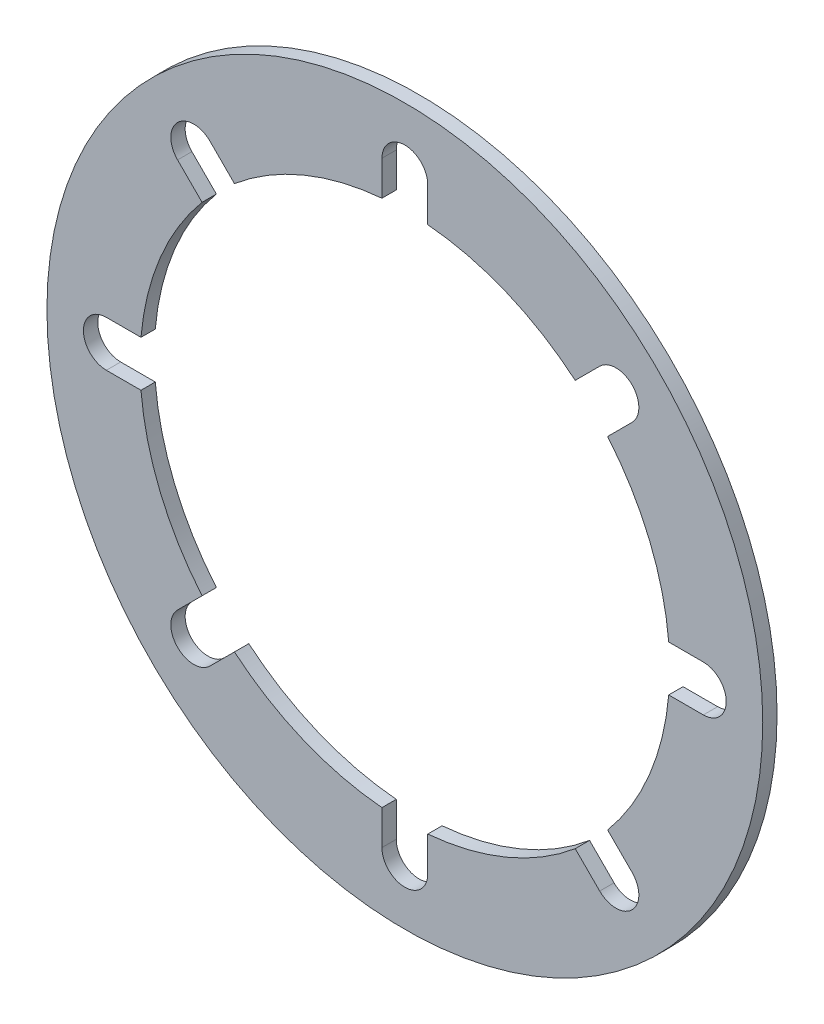
ISO-10303-21;
HEADER;
FILE_DESCRIPTION(('STEP AP214'),'2;1');
FILE_NAME('part.step','',(''),(''),'','','');
FILE_SCHEMA(('AUTOMOTIVE_DESIGN { 1 0 10303 214 1 1 1 1 }'));
ENDSEC;
DATA;
#1=APPLICATION_CONTEXT('core data for automotive mechanical design processes');
#2=APPLICATION_PROTOCOL_DEFINITION('international standard','automotive_design',2000,#1);
#3=PRODUCT_CONTEXT('',#1,'mechanical');
#4=PRODUCT('Part','Part','',(#3));
#5=PRODUCT_RELATED_PRODUCT_CATEGORY('part','',(#4));
#6=PRODUCT_DEFINITION_FORMATION('','',#4);
#7=PRODUCT_DEFINITION_CONTEXT('part definition',#1,'design');
#8=PRODUCT_DEFINITION('design','',#6,#7);
#9=PRODUCT_DEFINITION_SHAPE('','',#8);
#10=(LENGTH_UNIT() NAMED_UNIT(*) SI_UNIT(.MILLI.,.METRE.));
#11=(NAMED_UNIT(*) PLANE_ANGLE_UNIT() SI_UNIT($,.RADIAN.));
#12=(NAMED_UNIT(*) SI_UNIT($,.STERADIAN.) SOLID_ANGLE_UNIT());
#13=UNCERTAINTY_MEASURE_WITH_UNIT(LENGTH_MEASURE(1.E-05),#10,'distance_accuracy_value','');
#14=(GEOMETRIC_REPRESENTATION_CONTEXT(3) GLOBAL_UNCERTAINTY_ASSIGNED_CONTEXT((#13)) GLOBAL_UNIT_ASSIGNED_CONTEXT((#10,
#11,#12)) REPRESENTATION_CONTEXT('',''));
#15=CARTESIAN_POINT('',(0.,0.,0.));
#16=DIRECTION('',(0.,0.,1.));
#17=DIRECTION('',(1.,0.,0.));
#18=AXIS2_PLACEMENT_3D('',#15,#16,#17);
#19=CARTESIAN_POINT('',(0.,0.,1.));
#20=DIRECTION('',(0.,0.,1.));
#21=DIRECTION('',(1.,0.,0.));
#22=AXIS2_PLACEMENT_3D('',#19,#20,#21);
#23=PLANE('',#22);
#24=CARTESIAN_POINT('',(0.,0.,1.));
#25=DIRECTION('',(0.,0.,1.));
#26=DIRECTION('',(1.,0.,0.));
#27=AXIS2_PLACEMENT_3D('',#24,#25,#26);
#28=CIRCLE('',#27,25.);
#29=CARTESIAN_POINT('',(25.,0.,1.));
#30=VERTEX_POINT('',#29);
#31=EDGE_CURVE('E11',#30,#30,#28,.T.);
#32=ORIENTED_EDGE('',*,*,#31,.T.);
#33=EDGE_LOOP('',(#32));
#34=FACE_BOUND('',#33,.T.);
#35=DIRECTION('',(0.,-1.,0.));
#36=VECTOR('',#35,1.);
#37=CARTESIAN_POINT('',(-1.6,20.85,1.));
#38=LINE('',#37,#36);
#39=CARTESIAN_POINT('',(-1.6,20.85,1.));
#40=VERTEX_POINT('',#39);
#41=CARTESIAN_POINT('',(-1.6,18.4306809423852,1.));
#42=VERTEX_POINT('',#41);
#43=EDGE_CURVE('E258',#40,#42,#38,.T.);
#44=ORIENTED_EDGE('',*,*,#43,.F.);
#45=CARTESIAN_POINT('',(0.,20.85,1.));
#46=DIRECTION('',(0.,0.,1.));
#47=DIRECTION('',(1.,0.,0.));
#48=AXIS2_PLACEMENT_3D('',#45,#46,#47);
#49=CIRCLE('',#48,1.6);
#50=CARTESIAN_POINT('',(1.6,20.85,1.));
#51=VERTEX_POINT('',#50);
#52=EDGE_CURVE('E250',#51,#40,#49,.T.);
#53=ORIENTED_EDGE('',*,*,#52,.F.);
#54=DIRECTION('',(0.,1.,0.));
#55=VECTOR('',#54,1.);
#56=CARTESIAN_POINT('',(1.6,20.85,1.));
#57=LINE('',#56,#55);
#58=CARTESIAN_POINT('',(1.6,18.4306809423852,1.));
#59=VERTEX_POINT('',#58);
#60=EDGE_CURVE('E330',#59,#51,#57,.T.);
#61=ORIENTED_EDGE('',*,*,#60,.F.);
#62=CARTESIAN_POINT('',(0.,0.,1.));
#63=DIRECTION('',(0.,0.,1.));
#64=DIRECTION('',(1.,0.,0.));
#65=AXIS2_PLACEMENT_3D('',#62,#63,#64);
#66=CIRCLE('',#65,18.5);
#67=CARTESIAN_POINT('',(11.9010886263478,14.1638303261447,1.));
#68=VERTEX_POINT('',#67);
#69=EDGE_CURVE('E328',#68,#59,#66,.T.);
#70=ORIENTED_EDGE('',*,*,#69,.F.);
#71=DIRECTION('',(-0.707106781186545,-0.70710678118655,0.));
#72=VECTOR('',#71,1.);
#73=CARTESIAN_POINT('',(13.611805537841,15.874547237638,1.));
#74=LINE('',#73,#72);
#75=CARTESIAN_POINT('',(13.611805537841,15.874547237638,1.));
#76=VERTEX_POINT('',#75);
#77=EDGE_CURVE('E326',#76,#68,#74,.T.);
#78=ORIENTED_EDGE('',*,*,#77,.F.);
#79=CARTESIAN_POINT('',(14.7431763877395,14.7431763877395,1.));
#80=DIRECTION('',(0.,0.,1.));
#81=DIRECTION('',(1.,0.,0.));
#82=AXIS2_PLACEMENT_3D('',#79,#80,#81);
#83=CIRCLE('',#82,1.6);
#84=CARTESIAN_POINT('',(15.874547237638,13.611805537841,1.));
#85=VERTEX_POINT('',#84);
#86=EDGE_CURVE('E324',#85,#76,#83,.T.);
#87=ORIENTED_EDGE('',*,*,#86,.F.);
#88=DIRECTION('',(0.70710678118655,0.707106781186545,0.));
#89=VECTOR('',#88,1.);
#90=CARTESIAN_POINT('',(15.874547237638,13.611805537841,1.));
#91=LINE('',#90,#89);
#92=CARTESIAN_POINT('',(14.1638303261447,11.9010886263477,1.));
#93=VERTEX_POINT('',#92);
#94=EDGE_CURVE('E322',#93,#85,#91,.T.);
#95=ORIENTED_EDGE('',*,*,#94,.F.);
#96=CARTESIAN_POINT('',(0.,0.,1.));
#97=DIRECTION('',(0.,0.,1.));
#98=DIRECTION('',(1.,0.,0.));
#99=AXIS2_PLACEMENT_3D('',#96,#97,#98);
#100=CIRCLE('',#99,18.5);
#101=CARTESIAN_POINT('',(18.4306809423852,1.59999999999999,1.));
#102=VERTEX_POINT('',#101);
#103=EDGE_CURVE('E320',#102,#93,#100,.T.);
#104=ORIENTED_EDGE('',*,*,#103,.F.);
#105=DIRECTION('',(-1.,0.,0.));
#106=VECTOR('',#105,1.);
#107=CARTESIAN_POINT('',(20.85,1.6,1.));
#108=LINE('',#107,#106);
#109=CARTESIAN_POINT('',(20.85,1.6,1.));
#110=VERTEX_POINT('',#109);
#111=EDGE_CURVE('E318',#110,#102,#108,.T.);
#112=ORIENTED_EDGE('',*,*,#111,.F.);
#113=CARTESIAN_POINT('',(20.85,0.,1.));
#114=DIRECTION('',(0.,0.,1.));
#115=DIRECTION('',(1.,0.,0.));
#116=AXIS2_PLACEMENT_3D('',#113,#114,#115);
#117=CIRCLE('',#116,1.6);
#118=CARTESIAN_POINT('',(20.85,-1.6,1.));
#119=VERTEX_POINT('',#118);
#120=EDGE_CURVE('E316',#119,#110,#117,.T.);
#121=ORIENTED_EDGE('',*,*,#120,.F.);
#122=DIRECTION('',(1.,0.,0.));
#123=VECTOR('',#122,1.);
#124=CARTESIAN_POINT('',(20.85,-1.6,1.));
#125=LINE('',#124,#123);
#126=CARTESIAN_POINT('',(18.4306809423852,-1.59999999999999,1.));
#127=VERTEX_POINT('',#126);
#128=EDGE_CURVE('E314',#127,#119,#125,.T.);
#129=ORIENTED_EDGE('',*,*,#128,.F.);
#130=CARTESIAN_POINT('',(0.,0.,1.));
#131=DIRECTION('',(0.,0.,1.));
#132=DIRECTION('',(1.,0.,0.));
#133=AXIS2_PLACEMENT_3D('',#130,#131,#132);
#134=CIRCLE('',#133,18.5);
#135=CARTESIAN_POINT('',(14.1638303261447,-11.9010886263478,1.));
#136=VERTEX_POINT('',#135);
#137=EDGE_CURVE('E312',#136,#127,#134,.T.);
#138=ORIENTED_EDGE('',*,*,#137,.F.);
#139=DIRECTION('',(-0.70710678118655,0.707106781186545,0.));
#140=VECTOR('',#139,1.);
#141=CARTESIAN_POINT('',(15.874547237638,-13.611805537841,1.));
#142=LINE('',#141,#140);
#143=CARTESIAN_POINT('',(15.874547237638,-13.611805537841,1.));
#144=VERTEX_POINT('',#143);
#145=EDGE_CURVE('E310',#144,#136,#142,.T.);
#146=ORIENTED_EDGE('',*,*,#145,.F.);
#147=CARTESIAN_POINT('',(14.7431763877395,-14.7431763877395,1.));
#148=DIRECTION('',(0.,0.,1.));
#149=DIRECTION('',(1.,0.,0.));
#150=AXIS2_PLACEMENT_3D('',#147,#148,#149);
#151=CIRCLE('',#150,1.6);
#152=CARTESIAN_POINT('',(13.611805537841,-15.874547237638,1.));
#153=VERTEX_POINT('',#152);
#154=EDGE_CURVE('E308',#153,#144,#151,.T.);
#155=ORIENTED_EDGE('',*,*,#154,.F.);
#156=DIRECTION('',(0.707106781186545,-0.70710678118655,0.));
#157=VECTOR('',#156,1.);
#158=CARTESIAN_POINT('',(13.611805537841,-15.874547237638,1.));
#159=LINE('',#158,#157);
#160=CARTESIAN_POINT('',(11.9010886263477,-14.1638303261447,1.));
#161=VERTEX_POINT('',#160);
#162=EDGE_CURVE('E306',#161,#153,#159,.T.);
#163=ORIENTED_EDGE('',*,*,#162,.F.);
#164=CARTESIAN_POINT('',(0.,0.,1.));
#165=DIRECTION('',(0.,0.,1.));
#166=DIRECTION('',(1.,0.,0.));
#167=AXIS2_PLACEMENT_3D('',#164,#165,#166);
#168=CIRCLE('',#167,18.5);
#169=CARTESIAN_POINT('',(1.59999999999999,-18.4306809423852,1.));
#170=VERTEX_POINT('',#169);
#171=EDGE_CURVE('E304',#170,#161,#168,.T.);
#172=ORIENTED_EDGE('',*,*,#171,.F.);
#173=DIRECTION('',(0.,1.,0.));
#174=VECTOR('',#173,1.);
#175=CARTESIAN_POINT('',(1.6,-20.85,1.));
#176=LINE('',#175,#174);
#177=CARTESIAN_POINT('',(1.6,-20.85,1.));
#178=VERTEX_POINT('',#177);
#179=EDGE_CURVE('E302',#178,#170,#176,.T.);
#180=ORIENTED_EDGE('',*,*,#179,.F.);
#181=CARTESIAN_POINT('',(0.,-20.85,1.));
#182=DIRECTION('',(0.,0.,1.));
#183=DIRECTION('',(1.,0.,0.));
#184=AXIS2_PLACEMENT_3D('',#181,#182,#183);
#185=CIRCLE('',#184,1.6);
#186=CARTESIAN_POINT('',(-1.60000000000001,-20.85,1.));
#187=VERTEX_POINT('',#186);
#188=EDGE_CURVE('E300',#187,#178,#185,.T.);
#189=ORIENTED_EDGE('',*,*,#188,.F.);
#190=DIRECTION('',(0.,-1.,0.));
#191=VECTOR('',#190,1.);
#192=CARTESIAN_POINT('',(-1.60000000000001,-20.85,1.));
#193=LINE('',#192,#191);
#194=CARTESIAN_POINT('',(-1.60000000000001,-18.4306809423852,1.));
#195=VERTEX_POINT('',#194);
#196=EDGE_CURVE('E298',#195,#187,#193,.T.);
#197=ORIENTED_EDGE('',*,*,#196,.F.);
#198=CARTESIAN_POINT('',(0.,0.,1.));
#199=DIRECTION('',(0.,0.,1.));
#200=DIRECTION('',(1.,0.,0.));
#201=AXIS2_PLACEMENT_3D('',#198,#199,#200);
#202=CIRCLE('',#201,18.5);
#203=CARTESIAN_POINT('',(-11.9010886263478,-14.1638303261447,1.));
#204=VERTEX_POINT('',#203);
#205=EDGE_CURVE('E296',#204,#195,#202,.T.);
#206=ORIENTED_EDGE('',*,*,#205,.F.);
#207=DIRECTION('',(0.707106781186545,0.70710678118655,0.));
#208=VECTOR('',#207,1.);
#209=CARTESIAN_POINT('',(-13.611805537841,-15.874547237638,1.));
#210=LINE('',#209,#208);
#211=CARTESIAN_POINT('',(-13.611805537841,-15.874547237638,1.));
#212=VERTEX_POINT('',#211);
#213=EDGE_CURVE('E294',#212,#204,#210,.T.);
#214=ORIENTED_EDGE('',*,*,#213,.F.);
#215=CARTESIAN_POINT('',(-14.7431763877395,-14.7431763877395,1.));
#216=DIRECTION('',(0.,0.,1.));
#217=DIRECTION('',(1.,0.,0.));
#218=AXIS2_PLACEMENT_3D('',#215,#216,#217);
#219=CIRCLE('',#218,1.6);
#220=CARTESIAN_POINT('',(-15.874547237638,-13.611805537841,1.));
#221=VERTEX_POINT('',#220);
#222=EDGE_CURVE('E292',#221,#212,#219,.T.);
#223=ORIENTED_EDGE('',*,*,#222,.F.);
#224=DIRECTION('',(-0.70710678118655,-0.707106781186545,0.));
#225=VECTOR('',#224,1.);
#226=CARTESIAN_POINT('',(-15.874547237638,-13.611805537841,1.));
#227=LINE('',#226,#225);
#228=CARTESIAN_POINT('',(-14.1638303261447,-11.9010886263477,1.));
#229=VERTEX_POINT('',#228);
#230=EDGE_CURVE('E290',#229,#221,#227,.T.);
#231=ORIENTED_EDGE('',*,*,#230,.F.);
#232=CARTESIAN_POINT('',(0.,0.,1.));
#233=DIRECTION('',(0.,0.,1.));
#234=DIRECTION('',(1.,0.,0.));
#235=AXIS2_PLACEMENT_3D('',#232,#233,#234);
#236=CIRCLE('',#235,18.5);
#237=CARTESIAN_POINT('',(-18.4306809423852,-1.6,1.));
#238=VERTEX_POINT('',#237);
#239=EDGE_CURVE('E288',#238,#229,#236,.T.);
#240=ORIENTED_EDGE('',*,*,#239,.F.);
#241=DIRECTION('',(1.,0.,0.));
#242=VECTOR('',#241,1.);
#243=CARTESIAN_POINT('',(-20.85,-1.6,1.));
#244=LINE('',#243,#242);
#245=CARTESIAN_POINT('',(-20.85,-1.6,1.));
#246=VERTEX_POINT('',#245);
#247=EDGE_CURVE('E286',#246,#238,#244,.T.);
#248=ORIENTED_EDGE('',*,*,#247,.F.);
#249=CARTESIAN_POINT('',(-20.85,0.,1.));
#250=DIRECTION('',(0.,0.,1.));
#251=DIRECTION('',(1.,0.,0.));
#252=AXIS2_PLACEMENT_3D('',#249,#250,#251);
#253=CIRCLE('',#252,1.6);
#254=CARTESIAN_POINT('',(-20.85,1.6,1.));
#255=VERTEX_POINT('',#254);
#256=EDGE_CURVE('E284',#255,#246,#253,.T.);
#257=ORIENTED_EDGE('',*,*,#256,.F.);
#258=DIRECTION('',(-1.,0.,0.));
#259=VECTOR('',#258,1.);
#260=CARTESIAN_POINT('',(-20.85,1.6,1.));
#261=LINE('',#260,#259);
#262=CARTESIAN_POINT('',(-18.4306809423852,1.59999999999999,1.));
#263=VERTEX_POINT('',#262);
#264=EDGE_CURVE('E282',#263,#255,#261,.T.);
#265=ORIENTED_EDGE('',*,*,#264,.F.);
#266=CARTESIAN_POINT('',(0.,0.,1.));
#267=DIRECTION('',(0.,0.,1.));
#268=DIRECTION('',(1.,0.,0.));
#269=AXIS2_PLACEMENT_3D('',#266,#267,#268);
#270=CIRCLE('',#269,18.5);
#271=CARTESIAN_POINT('',(-14.1638303261447,11.9010886263478,1.));
#272=VERTEX_POINT('',#271);
#273=EDGE_CURVE('E280',#272,#263,#270,.T.);
#274=ORIENTED_EDGE('',*,*,#273,.F.);
#275=DIRECTION('',(0.707106781186548,-0.707106781186548,0.));
#276=VECTOR('',#275,1.);
#277=CARTESIAN_POINT('',(-15.874547237638,13.611805537841,1.));
#278=LINE('',#277,#276);
#279=CARTESIAN_POINT('',(-15.874547237638,13.611805537841,1.));
#280=VERTEX_POINT('',#279);
#281=EDGE_CURVE('E278',#280,#272,#278,.T.);
#282=ORIENTED_EDGE('',*,*,#281,.F.);
#283=CARTESIAN_POINT('',(-14.7431763877395,14.7431763877395,1.));
#284=DIRECTION('',(0.,0.,1.));
#285=DIRECTION('',(1.,0.,0.));
#286=AXIS2_PLACEMENT_3D('',#283,#284,#285);
#287=CIRCLE('',#286,1.6);
#288=CARTESIAN_POINT('',(-13.611805537841,15.874547237638,1.));
#289=VERTEX_POINT('',#288);
#290=EDGE_CURVE('E276',#289,#280,#287,.T.);
#291=ORIENTED_EDGE('',*,*,#290,.F.);
#292=DIRECTION('',(-0.707106781186543,0.707106781186552,0.));
#293=VECTOR('',#292,1.);
#294=CARTESIAN_POINT('',(-13.611805537841,15.874547237638,1.));
#295=LINE('',#294,#293);
#296=CARTESIAN_POINT('',(-11.9010886263478,14.1638303261447,1.));
#297=VERTEX_POINT('',#296);
#298=EDGE_CURVE('E272',#297,#289,#295,.T.);
#299=ORIENTED_EDGE('',*,*,#298,.F.);
#300=CARTESIAN_POINT('',(0.,0.,1.));
#301=DIRECTION('',(0.,0.,1.));
#302=DIRECTION('',(1.,0.,0.));
#303=AXIS2_PLACEMENT_3D('',#300,#301,#302);
#304=CIRCLE('',#303,18.5);
#305=EDGE_CURVE('E270',#42,#297,#304,.T.);
#306=ORIENTED_EDGE('',*,*,#305,.F.);
#307=EDGE_LOOP('',(#44,#53,#61,#70,#78,#87,#95,#104,#112,#121,#129,#138,#146,#155,#163,#172,
#180,#189,#197,#206,#214,#223,#231,#240,#248,#257,#265,#274,#282,#291,#299,#306));
#308=FACE_BOUND('',#307,.T.);
#309=ADVANCED_FACE('F41',(#34,#308),#23,.T.);
#310=CARTESIAN_POINT('',(0.,0.,0.));
#311=DIRECTION('',(0.,0.,1.));
#312=DIRECTION('',(1.,0.,0.));
#313=AXIS2_PLACEMENT_3D('',#310,#311,#312);
#314=PLANE('',#313);
#315=CARTESIAN_POINT('',(0.,0.,0.));
#316=DIRECTION('',(0.,0.,1.));
#317=DIRECTION('',(1.,0.,0.));
#318=AXIS2_PLACEMENT_3D('',#315,#316,#317);
#319=CIRCLE('',#318,25.);
#320=CARTESIAN_POINT('',(25.,0.,0.));
#321=VERTEX_POINT('',#320);
#322=EDGE_CURVE('E45',#321,#321,#319,.T.);
#323=ORIENTED_EDGE('',*,*,#322,.F.);
#324=EDGE_LOOP('',(#323));
#325=FACE_BOUND('',#324,.T.);
#326=CARTESIAN_POINT('',(0.,20.85,0.));
#327=DIRECTION('',(0.,0.,1.));
#328=DIRECTION('',(1.,0.,0.));
#329=AXIS2_PLACEMENT_3D('',#326,#327,#328);
#330=CIRCLE('',#329,1.6);
#331=CARTESIAN_POINT('',(1.6,20.85,0.));
#332=VERTEX_POINT('',#331);
#333=CARTESIAN_POINT('',(-1.6,20.85,0.));
#334=VERTEX_POINT('',#333);
#335=EDGE_CURVE('E64',#332,#334,#330,.T.);
#336=ORIENTED_EDGE('',*,*,#335,.T.);
#337=DIRECTION('',(0.,-1.,0.));
#338=VECTOR('',#337,1.);
#339=CARTESIAN_POINT('',(-1.6,20.85,0.));
#340=LINE('',#339,#338);
#341=CARTESIAN_POINT('',(-1.6,18.4306809423852,0.));
#342=VERTEX_POINT('',#341);
#343=EDGE_CURVE('E265',#334,#342,#340,.T.);
#344=ORIENTED_EDGE('',*,*,#343,.T.);
#345=CARTESIAN_POINT('',(0.,0.,0.));
#346=DIRECTION('',(0.,0.,1.));
#347=DIRECTION('',(1.,0.,0.));
#348=AXIS2_PLACEMENT_3D('',#345,#346,#347);
#349=CIRCLE('',#348,18.5);
#350=CARTESIAN_POINT('',(-11.9010886263478,14.1638303261447,0.));
#351=VERTEX_POINT('',#350);
#352=EDGE_CURVE('E334',#342,#351,#349,.T.);
#353=ORIENTED_EDGE('',*,*,#352,.T.);
#354=DIRECTION('',(-0.707106781186543,0.707106781186552,0.));
#355=VECTOR('',#354,1.);
#356=CARTESIAN_POINT('',(-13.611805537841,15.874547237638,0.));
#357=LINE('',#356,#355);
#358=CARTESIAN_POINT('',(-13.611805537841,15.874547237638,0.));
#359=VERTEX_POINT('',#358);
#360=EDGE_CURVE('E337',#351,#359,#357,.T.);
#361=ORIENTED_EDGE('',*,*,#360,.T.);
#362=CARTESIAN_POINT('',(-14.7431763877395,14.7431763877395,0.));
#363=DIRECTION('',(0.,0.,1.));
#364=DIRECTION('',(1.,0.,0.));
#365=AXIS2_PLACEMENT_3D('',#362,#363,#364);
#366=CIRCLE('',#365,1.6);
#367=CARTESIAN_POINT('',(-15.874547237638,13.611805537841,0.));
#368=VERTEX_POINT('',#367);
#369=EDGE_CURVE('E340',#359,#368,#366,.T.);
#370=ORIENTED_EDGE('',*,*,#369,.T.);
#371=DIRECTION('',(0.707106781186548,-0.707106781186548,0.));
#372=VECTOR('',#371,1.);
#373=CARTESIAN_POINT('',(-15.874547237638,13.611805537841,0.));
#374=LINE('',#373,#372);
#375=CARTESIAN_POINT('',(-14.1638303261447,11.9010886263478,0.));
#376=VERTEX_POINT('',#375);
#377=EDGE_CURVE('E343',#368,#376,#374,.T.);
#378=ORIENTED_EDGE('',*,*,#377,.T.);
#379=CARTESIAN_POINT('',(0.,0.,0.));
#380=DIRECTION('',(0.,0.,1.));
#381=DIRECTION('',(1.,0.,0.));
#382=AXIS2_PLACEMENT_3D('',#379,#380,#381);
#383=CIRCLE('',#382,18.5);
#384=CARTESIAN_POINT('',(-18.4306809423852,1.59999999999999,0.));
#385=VERTEX_POINT('',#384);
#386=EDGE_CURVE('E346',#376,#385,#383,.T.);
#387=ORIENTED_EDGE('',*,*,#386,.T.);
#388=DIRECTION('',(-1.,0.,0.));
#389=VECTOR('',#388,1.);
#390=CARTESIAN_POINT('',(-20.85,1.6,0.));
#391=LINE('',#390,#389);
#392=CARTESIAN_POINT('',(-20.85,1.6,0.));
#393=VERTEX_POINT('',#392);
#394=EDGE_CURVE('E349',#385,#393,#391,.T.);
#395=ORIENTED_EDGE('',*,*,#394,.T.);
#396=CARTESIAN_POINT('',(-20.85,0.,0.));
#397=DIRECTION('',(0.,0.,1.));
#398=DIRECTION('',(1.,0.,0.));
#399=AXIS2_PLACEMENT_3D('',#396,#397,#398);
#400=CIRCLE('',#399,1.6);
#401=CARTESIAN_POINT('',(-20.85,-1.6,0.));
#402=VERTEX_POINT('',#401);
#403=EDGE_CURVE('E352',#393,#402,#400,.T.);
#404=ORIENTED_EDGE('',*,*,#403,.T.);
#405=DIRECTION('',(1.,0.,0.));
#406=VECTOR('',#405,1.);
#407=CARTESIAN_POINT('',(-20.85,-1.6,0.));
#408=LINE('',#407,#406);
#409=CARTESIAN_POINT('',(-18.4306809423852,-1.6,0.));
#410=VERTEX_POINT('',#409);
#411=EDGE_CURVE('E355',#402,#410,#408,.T.);
#412=ORIENTED_EDGE('',*,*,#411,.T.);
#413=CARTESIAN_POINT('',(0.,0.,0.));
#414=DIRECTION('',(0.,0.,1.));
#415=DIRECTION('',(1.,0.,0.));
#416=AXIS2_PLACEMENT_3D('',#413,#414,#415);
#417=CIRCLE('',#416,18.5);
#418=CARTESIAN_POINT('',(-14.1638303261447,-11.9010886263477,0.));
#419=VERTEX_POINT('',#418);
#420=EDGE_CURVE('E358',#410,#419,#417,.T.);
#421=ORIENTED_EDGE('',*,*,#420,.T.);
#422=DIRECTION('',(-0.70710678118655,-0.707106781186545,0.));
#423=VECTOR('',#422,1.);
#424=CARTESIAN_POINT('',(-15.874547237638,-13.611805537841,0.));
#425=LINE('',#424,#423);
#426=CARTESIAN_POINT('',(-15.874547237638,-13.611805537841,0.));
#427=VERTEX_POINT('',#426);
#428=EDGE_CURVE('E361',#419,#427,#425,.T.);
#429=ORIENTED_EDGE('',*,*,#428,.T.);
#430=CARTESIAN_POINT('',(-14.7431763877395,-14.7431763877395,0.));
#431=DIRECTION('',(0.,0.,1.));
#432=DIRECTION('',(1.,0.,0.));
#433=AXIS2_PLACEMENT_3D('',#430,#431,#432);
#434=CIRCLE('',#433,1.6);
#435=CARTESIAN_POINT('',(-13.611805537841,-15.874547237638,0.));
#436=VERTEX_POINT('',#435);
#437=EDGE_CURVE('E364',#427,#436,#434,.T.);
#438=ORIENTED_EDGE('',*,*,#437,.T.);
#439=DIRECTION('',(0.707106781186545,0.70710678118655,0.));
#440=VECTOR('',#439,1.);
#441=CARTESIAN_POINT('',(-13.611805537841,-15.874547237638,0.));
#442=LINE('',#441,#440);
#443=CARTESIAN_POINT('',(-11.9010886263478,-14.1638303261447,0.));
#444=VERTEX_POINT('',#443);
#445=EDGE_CURVE('E367',#436,#444,#442,.T.);
#446=ORIENTED_EDGE('',*,*,#445,.T.);
#447=CARTESIAN_POINT('',(0.,0.,0.));
#448=DIRECTION('',(0.,0.,1.));
#449=DIRECTION('',(1.,0.,0.));
#450=AXIS2_PLACEMENT_3D('',#447,#448,#449);
#451=CIRCLE('',#450,18.5);
#452=CARTESIAN_POINT('',(-1.60000000000001,-18.4306809423852,0.));
#453=VERTEX_POINT('',#452);
#454=EDGE_CURVE('E370',#444,#453,#451,.T.);
#455=ORIENTED_EDGE('',*,*,#454,.T.);
#456=DIRECTION('',(0.,-1.,0.));
#457=VECTOR('',#456,1.);
#458=CARTESIAN_POINT('',(-1.60000000000001,-20.85,0.));
#459=LINE('',#458,#457);
#460=CARTESIAN_POINT('',(-1.60000000000001,-20.85,0.));
#461=VERTEX_POINT('',#460);
#462=EDGE_CURVE('E373',#453,#461,#459,.T.);
#463=ORIENTED_EDGE('',*,*,#462,.T.);
#464=CARTESIAN_POINT('',(0.,-20.85,0.));
#465=DIRECTION('',(0.,0.,1.));
#466=DIRECTION('',(1.,0.,0.));
#467=AXIS2_PLACEMENT_3D('',#464,#465,#466);
#468=CIRCLE('',#467,1.6);
#469=CARTESIAN_POINT('',(1.6,-20.85,0.));
#470=VERTEX_POINT('',#469);
#471=EDGE_CURVE('E376',#461,#470,#468,.T.);
#472=ORIENTED_EDGE('',*,*,#471,.T.);
#473=DIRECTION('',(0.,1.,0.));
#474=VECTOR('',#473,1.);
#475=CARTESIAN_POINT('',(1.6,-20.85,0.));
#476=LINE('',#475,#474);
#477=CARTESIAN_POINT('',(1.59999999999999,-18.4306809423852,0.));
#478=VERTEX_POINT('',#477);
#479=EDGE_CURVE('E379',#470,#478,#476,.T.);
#480=ORIENTED_EDGE('',*,*,#479,.T.);
#481=CARTESIAN_POINT('',(0.,0.,0.));
#482=DIRECTION('',(0.,0.,1.));
#483=DIRECTION('',(1.,0.,0.));
#484=AXIS2_PLACEMENT_3D('',#481,#482,#483);
#485=CIRCLE('',#484,18.5);
#486=CARTESIAN_POINT('',(11.9010886263477,-14.1638303261447,0.));
#487=VERTEX_POINT('',#486);
#488=EDGE_CURVE('E382',#478,#487,#485,.T.);
#489=ORIENTED_EDGE('',*,*,#488,.T.);
#490=DIRECTION('',(0.707106781186545,-0.70710678118655,0.));
#491=VECTOR('',#490,1.);
#492=CARTESIAN_POINT('',(13.611805537841,-15.874547237638,0.));
#493=LINE('',#492,#491);
#494=CARTESIAN_POINT('',(13.611805537841,-15.874547237638,0.));
#495=VERTEX_POINT('',#494);
#496=EDGE_CURVE('E385',#487,#495,#493,.T.);
#497=ORIENTED_EDGE('',*,*,#496,.T.);
#498=CARTESIAN_POINT('',(14.7431763877395,-14.7431763877395,0.));
#499=DIRECTION('',(0.,0.,1.));
#500=DIRECTION('',(1.,0.,0.));
#501=AXIS2_PLACEMENT_3D('',#498,#499,#500);
#502=CIRCLE('',#501,1.6);
#503=CARTESIAN_POINT('',(15.874547237638,-13.611805537841,0.));
#504=VERTEX_POINT('',#503);
#505=EDGE_CURVE('E388',#495,#504,#502,.T.);
#506=ORIENTED_EDGE('',*,*,#505,.T.);
#507=DIRECTION('',(-0.70710678118655,0.707106781186545,0.));
#508=VECTOR('',#507,1.);
#509=CARTESIAN_POINT('',(15.874547237638,-13.611805537841,0.));
#510=LINE('',#509,#508);
#511=CARTESIAN_POINT('',(14.1638303261447,-11.9010886263478,0.));
#512=VERTEX_POINT('',#511);
#513=EDGE_CURVE('E391',#504,#512,#510,.T.);
#514=ORIENTED_EDGE('',*,*,#513,.T.);
#515=CARTESIAN_POINT('',(0.,0.,0.));
#516=DIRECTION('',(0.,0.,1.));
#517=DIRECTION('',(1.,0.,0.));
#518=AXIS2_PLACEMENT_3D('',#515,#516,#517);
#519=CIRCLE('',#518,18.5);
#520=CARTESIAN_POINT('',(18.4306809423852,-1.59999999999999,0.));
#521=VERTEX_POINT('',#520);
#522=EDGE_CURVE('E394',#512,#521,#519,.T.);
#523=ORIENTED_EDGE('',*,*,#522,.T.);
#524=DIRECTION('',(1.,0.,0.));
#525=VECTOR('',#524,1.);
#526=CARTESIAN_POINT('',(20.85,-1.6,0.));
#527=LINE('',#526,#525);
#528=CARTESIAN_POINT('',(20.85,-1.6,0.));
#529=VERTEX_POINT('',#528);
#530=EDGE_CURVE('E397',#521,#529,#527,.T.);
#531=ORIENTED_EDGE('',*,*,#530,.T.);
#532=CARTESIAN_POINT('',(20.85,0.,0.));
#533=DIRECTION('',(0.,0.,1.));
#534=DIRECTION('',(1.,0.,0.));
#535=AXIS2_PLACEMENT_3D('',#532,#533,#534);
#536=CIRCLE('',#535,1.6);
#537=CARTESIAN_POINT('',(20.85,1.6,0.));
#538=VERTEX_POINT('',#537);
#539=EDGE_CURVE('E400',#529,#538,#536,.T.);
#540=ORIENTED_EDGE('',*,*,#539,.T.);
#541=DIRECTION('',(-1.,0.,0.));
#542=VECTOR('',#541,1.);
#543=CARTESIAN_POINT('',(20.85,1.6,0.));
#544=LINE('',#543,#542);
#545=CARTESIAN_POINT('',(18.4306809423852,1.59999999999999,0.));
#546=VERTEX_POINT('',#545);
#547=EDGE_CURVE('E403',#538,#546,#544,.T.);
#548=ORIENTED_EDGE('',*,*,#547,.T.);
#549=CARTESIAN_POINT('',(0.,0.,0.));
#550=DIRECTION('',(0.,0.,1.));
#551=DIRECTION('',(1.,0.,0.));
#552=AXIS2_PLACEMENT_3D('',#549,#550,#551);
#553=CIRCLE('',#552,18.5);
#554=CARTESIAN_POINT('',(14.1638303261447,11.9010886263477,0.));
#555=VERTEX_POINT('',#554);
#556=EDGE_CURVE('E406',#546,#555,#553,.T.);
#557=ORIENTED_EDGE('',*,*,#556,.T.);
#558=DIRECTION('',(0.70710678118655,0.707106781186545,0.));
#559=VECTOR('',#558,1.);
#560=CARTESIAN_POINT('',(15.874547237638,13.611805537841,0.));
#561=LINE('',#560,#559);
#562=CARTESIAN_POINT('',(15.874547237638,13.611805537841,0.));
#563=VERTEX_POINT('',#562);
#564=EDGE_CURVE('E409',#555,#563,#561,.T.);
#565=ORIENTED_EDGE('',*,*,#564,.T.);
#566=CARTESIAN_POINT('',(14.7431763877395,14.7431763877395,0.));
#567=DIRECTION('',(0.,0.,1.));
#568=DIRECTION('',(1.,0.,0.));
#569=AXIS2_PLACEMENT_3D('',#566,#567,#568);
#570=CIRCLE('',#569,1.6);
#571=CARTESIAN_POINT('',(13.611805537841,15.874547237638,0.));
#572=VERTEX_POINT('',#571);
#573=EDGE_CURVE('E412',#563,#572,#570,.T.);
#574=ORIENTED_EDGE('',*,*,#573,.T.);
#575=DIRECTION('',(-0.707106781186545,-0.70710678118655,0.));
#576=VECTOR('',#575,1.);
#577=CARTESIAN_POINT('',(13.611805537841,15.874547237638,0.));
#578=LINE('',#577,#576);
#579=CARTESIAN_POINT('',(11.9010886263478,14.1638303261447,0.));
#580=VERTEX_POINT('',#579);
#581=EDGE_CURVE('E415',#572,#580,#578,.T.);
#582=ORIENTED_EDGE('',*,*,#581,.T.);
#583=CARTESIAN_POINT('',(0.,0.,0.));
#584=DIRECTION('',(0.,0.,1.));
#585=DIRECTION('',(1.,0.,0.));
#586=AXIS2_PLACEMENT_3D('',#583,#584,#585);
#587=CIRCLE('',#586,18.5);
#588=CARTESIAN_POINT('',(1.6,18.4306809423852,0.));
#589=VERTEX_POINT('',#588);
#590=EDGE_CURVE('E418',#580,#589,#587,.T.);
#591=ORIENTED_EDGE('',*,*,#590,.T.);
#592=DIRECTION('',(0.,1.,0.));
#593=VECTOR('',#592,1.);
#594=CARTESIAN_POINT('',(1.6,20.85,0.));
#595=LINE('',#594,#593);
#596=EDGE_CURVE('E259',#589,#332,#595,.T.);
#597=ORIENTED_EDGE('',*,*,#596,.T.);
#598=EDGE_LOOP('',(#336,#344,#353,#361,#370,#378,#387,#395,#404,#412,#421,#429,#438,#446,#455,
#463,#472,#480,#489,#497,#506,#514,#523,#531,#540,#548,#557,#565,#574,#582,#591,#597));
#599=FACE_BOUND('',#598,.T.);
#600=ADVANCED_FACE('F487',(#325,#599),#314,.F.);
#601=CARTESIAN_POINT('',(0.,0.,1.));
#602=DIRECTION('',(0.,0.,-1.));
#603=DIRECTION('',(-1.,0.,0.));
#604=AXIS2_PLACEMENT_3D('',#601,#602,#603);
#605=CYLINDRICAL_SURFACE('',#604,25.);
#606=ORIENTED_EDGE('',*,*,#31,.F.);
#607=EDGE_LOOP('',(#606));
#608=FACE_BOUND('',#607,.T.);
#609=ORIENTED_EDGE('',*,*,#322,.T.);
#610=EDGE_LOOP('',(#609));
#611=FACE_BOUND('',#610,.T.);
#612=ADVANCED_FACE('F43',(#608,#611),#605,.T.);
#613=CARTESIAN_POINT('',(0.,20.85,1.));
#614=DIRECTION('',(0.,0.,-1.));
#615=DIRECTION('',(-1.,0.,0.));
#616=AXIS2_PLACEMENT_3D('',#613,#614,#615);
#617=CYLINDRICAL_SURFACE('',#616,1.6);
#618=ORIENTED_EDGE('',*,*,#335,.F.);
#619=DIRECTION('',(0.,0.,-1.));
#620=VECTOR('',#619,1.);
#621=CARTESIAN_POINT('',(1.6,20.85,1.));
#622=LINE('',#621,#620);
#623=EDGE_CURVE('E254',#51,#332,#622,.T.);
#624=ORIENTED_EDGE('',*,*,#623,.F.);
#625=ORIENTED_EDGE('',*,*,#52,.T.);
#626=DIRECTION('',(0.,0.,-1.));
#627=VECTOR('',#626,1.);
#628=CARTESIAN_POINT('',(-1.6,20.85,1.));
#629=LINE('',#628,#627);
#630=EDGE_CURVE('E253',#40,#334,#629,.T.);
#631=ORIENTED_EDGE('',*,*,#630,.T.);
#632=EDGE_LOOP('',(#618,#624,#625,#631));
#633=FACE_BOUND('',#632,.T.);
#634=ADVANCED_FACE('F252',(#633),#617,.F.);
#635=CARTESIAN_POINT('',(-1.6,20.85,1.));
#636=DIRECTION('',(1.,0.,0.));
#637=DIRECTION('',(0.,0.,-1.));
#638=AXIS2_PLACEMENT_3D('',#635,#636,#637);
#639=PLANE('',#638);
#640=ORIENTED_EDGE('',*,*,#343,.F.);
#641=ORIENTED_EDGE('',*,*,#630,.F.);
#642=ORIENTED_EDGE('',*,*,#43,.T.);
#643=DIRECTION('',(0.,0.,-1.));
#644=VECTOR('',#643,1.);
#645=CARTESIAN_POINT('',(-1.6,18.4306809423852,1.));
#646=LINE('',#645,#644);
#647=EDGE_CURVE('E266',#42,#342,#646,.T.);
#648=ORIENTED_EDGE('',*,*,#647,.T.);
#649=EDGE_LOOP('',(#640,#641,#642,#648));
#650=FACE_BOUND('',#649,.T.);
#651=ADVANCED_FACE('F262',(#650),#639,.T.);
#652=CARTESIAN_POINT('',(0.,0.,1.));
#653=DIRECTION('',(0.,0.,-1.));
#654=DIRECTION('',(-1.,0.,0.));
#655=AXIS2_PLACEMENT_3D('',#652,#653,#654);
#656=CYLINDRICAL_SURFACE('',#655,18.5);
#657=ORIENTED_EDGE('',*,*,#352,.F.);
#658=ORIENTED_EDGE('',*,*,#647,.F.);
#659=ORIENTED_EDGE('',*,*,#305,.T.);
#660=DIRECTION('',(0.,0.,-1.));
#661=VECTOR('',#660,1.);
#662=CARTESIAN_POINT('',(-11.9010886263478,14.1638303261447,1.));
#663=LINE('',#662,#661);
#664=EDGE_CURVE('E479',#297,#351,#663,.T.);
#665=ORIENTED_EDGE('',*,*,#664,.T.);
#666=EDGE_LOOP('',(#657,#658,#659,#665));
#667=FACE_BOUND('',#666,.T.);
#668=ADVANCED_FACE('F483',(#667),#656,.F.);
#669=CARTESIAN_POINT('',(-13.611805537841,15.874547237638,1.));
#670=DIRECTION('',(-0.707106781186552,-0.707106781186543,0.));
#671=DIRECTION('',(0.707106781186543,-0.707106781186552,0.));
#672=AXIS2_PLACEMENT_3D('',#669,#670,#671);
#673=PLANE('',#672);
#674=ORIENTED_EDGE('',*,*,#360,.F.);
#675=ORIENTED_EDGE('',*,*,#664,.F.);
#676=ORIENTED_EDGE('',*,*,#298,.T.);
#677=DIRECTION('',(0.,0.,-1.));
#678=VECTOR('',#677,1.);
#679=CARTESIAN_POINT('',(-13.611805537841,15.874547237638,1.));
#680=LINE('',#679,#678);
#681=EDGE_CURVE('E477',#289,#359,#680,.T.);
#682=ORIENTED_EDGE('',*,*,#681,.T.);
#683=EDGE_LOOP('',(#674,#675,#676,#682));
#684=FACE_BOUND('',#683,.T.);
#685=ADVANCED_FACE('F625',(#684),#673,.T.);
#686=CARTESIAN_POINT('',(-14.7431763877395,14.7431763877395,1.));
#687=DIRECTION('',(0.,0.,-1.));
#688=DIRECTION('',(-1.,0.,0.));
#689=AXIS2_PLACEMENT_3D('',#686,#687,#688);
#690=CYLINDRICAL_SURFACE('',#689,1.6);
#691=ORIENTED_EDGE('',*,*,#369,.F.);
#692=ORIENTED_EDGE('',*,*,#681,.F.);
#693=ORIENTED_EDGE('',*,*,#290,.T.);
#694=DIRECTION('',(0.,0.,-1.));
#695=VECTOR('',#694,1.);
#696=CARTESIAN_POINT('',(-15.874547237638,13.611805537841,1.));
#697=LINE('',#696,#695);
#698=EDGE_CURVE('E475',#280,#368,#697,.T.);
#699=ORIENTED_EDGE('',*,*,#698,.T.);
#700=EDGE_LOOP('',(#691,#692,#693,#699));
#701=FACE_BOUND('',#700,.T.);
#702=ADVANCED_FACE('F622',(#701),#690,.F.);
#703=CARTESIAN_POINT('',(-15.874547237638,13.611805537841,1.));
#704=DIRECTION('',(0.707106781186547,0.707106781186547,0.));
#705=DIRECTION('',(-0.707106781186548,0.707106781186548,0.));
#706=AXIS2_PLACEMENT_3D('',#703,#704,#705);
#707=PLANE('',#706);
#708=ORIENTED_EDGE('',*,*,#377,.F.);
#709=ORIENTED_EDGE('',*,*,#698,.F.);
#710=ORIENTED_EDGE('',*,*,#281,.T.);
#711=DIRECTION('',(0.,0.,-1.));
#712=VECTOR('',#711,1.);
#713=CARTESIAN_POINT('',(-14.1638303261447,11.9010886263478,1.));
#714=LINE('',#713,#712);
#715=EDGE_CURVE('E473',#272,#376,#714,.T.);
#716=ORIENTED_EDGE('',*,*,#715,.T.);
#717=EDGE_LOOP('',(#708,#709,#710,#716));
#718=FACE_BOUND('',#717,.T.);
#719=ADVANCED_FACE('F618',(#718),#707,.T.);
#720=CARTESIAN_POINT('',(0.,0.,1.));
#721=DIRECTION('',(0.,0.,-1.));
#722=DIRECTION('',(-1.,0.,0.));
#723=AXIS2_PLACEMENT_3D('',#720,#721,#722);
#724=CYLINDRICAL_SURFACE('',#723,18.5);
#725=ORIENTED_EDGE('',*,*,#386,.F.);
#726=ORIENTED_EDGE('',*,*,#715,.F.);
#727=ORIENTED_EDGE('',*,*,#273,.T.);
#728=DIRECTION('',(0.,0.,-1.));
#729=VECTOR('',#728,1.);
#730=CARTESIAN_POINT('',(-18.4306809423852,1.59999999999999,1.));
#731=LINE('',#730,#729);
#732=EDGE_CURVE('E471',#263,#385,#731,.T.);
#733=ORIENTED_EDGE('',*,*,#732,.T.);
#734=EDGE_LOOP('',(#725,#726,#727,#733));
#735=FACE_BOUND('',#734,.T.);
#736=ADVANCED_FACE('F615',(#735),#724,.F.);
#737=CARTESIAN_POINT('',(-20.85,1.6,1.));
#738=DIRECTION('',(0.,-1.,0.));
#739=DIRECTION('',(1.,0.,0.));
#740=AXIS2_PLACEMENT_3D('',#737,#738,#739);
#741=PLANE('',#740);
#742=ORIENTED_EDGE('',*,*,#394,.F.);
#743=ORIENTED_EDGE('',*,*,#732,.F.);
#744=ORIENTED_EDGE('',*,*,#264,.T.);
#745=DIRECTION('',(0.,0.,-1.));
#746=VECTOR('',#745,1.);
#747=CARTESIAN_POINT('',(-20.85,1.6,1.));
#748=LINE('',#747,#746);
#749=EDGE_CURVE('E469',#255,#393,#748,.T.);
#750=ORIENTED_EDGE('',*,*,#749,.T.);
#751=EDGE_LOOP('',(#742,#743,#744,#750));
#752=FACE_BOUND('',#751,.T.);
#753=ADVANCED_FACE('F607',(#752),#741,.T.);
#754=CARTESIAN_POINT('',(-20.85,0.,1.));
#755=DIRECTION('',(0.,0.,-1.));
#756=DIRECTION('',(-1.,0.,0.));
#757=AXIS2_PLACEMENT_3D('',#754,#755,#756);
#758=CYLINDRICAL_SURFACE('',#757,1.6);
#759=ORIENTED_EDGE('',*,*,#403,.F.);
#760=ORIENTED_EDGE('',*,*,#749,.F.);
#761=ORIENTED_EDGE('',*,*,#256,.T.);
#762=DIRECTION('',(0.,0.,-1.));
#763=VECTOR('',#762,1.);
#764=CARTESIAN_POINT('',(-20.85,-1.6,1.));
#765=LINE('',#764,#763);
#766=EDGE_CURVE('E467',#246,#402,#765,.T.);
#767=ORIENTED_EDGE('',*,*,#766,.T.);
#768=EDGE_LOOP('',(#759,#760,#761,#767));
#769=FACE_BOUND('',#768,.T.);
#770=ADVANCED_FACE('F603',(#769),#758,.F.);
#771=CARTESIAN_POINT('',(-20.85,-1.6,1.));
#772=DIRECTION('',(0.,1.,0.));
#773=DIRECTION('',(-1.,0.,0.));
#774=AXIS2_PLACEMENT_3D('',#771,#772,#773);
#775=PLANE('',#774);
#776=ORIENTED_EDGE('',*,*,#411,.F.);
#777=ORIENTED_EDGE('',*,*,#766,.F.);
#778=ORIENTED_EDGE('',*,*,#247,.T.);
#779=DIRECTION('',(0.,0.,-1.));
#780=VECTOR('',#779,1.);
#781=CARTESIAN_POINT('',(-18.4306809423852,-1.6,1.));
#782=LINE('',#781,#780);
#783=EDGE_CURVE('E465',#238,#410,#782,.T.);
#784=ORIENTED_EDGE('',*,*,#783,.T.);
#785=EDGE_LOOP('',(#776,#777,#778,#784));
#786=FACE_BOUND('',#785,.T.);
#787=ADVANCED_FACE('F600',(#786),#775,.T.);
#788=CARTESIAN_POINT('',(0.,0.,1.));
#789=DIRECTION('',(0.,0.,-1.));
#790=DIRECTION('',(-1.,0.,0.));
#791=AXIS2_PLACEMENT_3D('',#788,#789,#790);
#792=CYLINDRICAL_SURFACE('',#791,18.5);
#793=ORIENTED_EDGE('',*,*,#420,.F.);
#794=ORIENTED_EDGE('',*,*,#783,.F.);
#795=ORIENTED_EDGE('',*,*,#239,.T.);
#796=DIRECTION('',(0.,0.,-1.));
#797=VECTOR('',#796,1.);
#798=CARTESIAN_POINT('',(-14.1638303261447,-11.9010886263477,1.));
#799=LINE('',#798,#797);
#800=EDGE_CURVE('E463',#229,#419,#799,.T.);
#801=ORIENTED_EDGE('',*,*,#800,.T.);
#802=EDGE_LOOP('',(#793,#794,#795,#801));
#803=FACE_BOUND('',#802,.T.);
#804=ADVANCED_FACE('F592',(#803),#792,.F.);
#805=CARTESIAN_POINT('',(-15.874547237638,-13.611805537841,1.));
#806=DIRECTION('',(0.707106781186545,-0.70710678118655,0.));
#807=DIRECTION('',(0.70710678118655,0.707106781186545,0.));
#808=AXIS2_PLACEMENT_3D('',#805,#806,#807);
#809=PLANE('',#808);
#810=ORIENTED_EDGE('',*,*,#428,.F.);
#811=ORIENTED_EDGE('',*,*,#800,.F.);
#812=ORIENTED_EDGE('',*,*,#230,.T.);
#813=DIRECTION('',(0.,0.,-1.));
#814=VECTOR('',#813,1.);
#815=CARTESIAN_POINT('',(-15.874547237638,-13.611805537841,1.));
#816=LINE('',#815,#814);
#817=EDGE_CURVE('E461',#221,#427,#816,.T.);
#818=ORIENTED_EDGE('',*,*,#817,.T.);
#819=EDGE_LOOP('',(#810,#811,#812,#818));
#820=FACE_BOUND('',#819,.T.);
#821=ADVANCED_FACE('F588',(#820),#809,.T.);
#822=CARTESIAN_POINT('',(-14.7431763877395,-14.7431763877395,1.));
#823=DIRECTION('',(0.,0.,-1.));
#824=DIRECTION('',(-1.,0.,0.));
#825=AXIS2_PLACEMENT_3D('',#822,#823,#824);
#826=CYLINDRICAL_SURFACE('',#825,1.6);
#827=ORIENTED_EDGE('',*,*,#437,.F.);
#828=ORIENTED_EDGE('',*,*,#817,.F.);
#829=ORIENTED_EDGE('',*,*,#222,.T.);
#830=DIRECTION('',(0.,0.,-1.));
#831=VECTOR('',#830,1.);
#832=CARTESIAN_POINT('',(-13.611805537841,-15.874547237638,1.));
#833=LINE('',#832,#831);
#834=EDGE_CURVE('E459',#212,#436,#833,.T.);
#835=ORIENTED_EDGE('',*,*,#834,.T.);
#836=EDGE_LOOP('',(#827,#828,#829,#835));
#837=FACE_BOUND('',#836,.T.);
#838=ADVANCED_FACE('F585',(#837),#826,.F.);
#839=CARTESIAN_POINT('',(-13.611805537841,-15.874547237638,1.));
#840=DIRECTION('',(-0.70710678118655,0.707106781186545,0.));
#841=DIRECTION('',(-0.707106781186545,-0.70710678118655,0.));
#842=AXIS2_PLACEMENT_3D('',#839,#840,#841);
#843=PLANE('',#842);
#844=ORIENTED_EDGE('',*,*,#445,.F.);
#845=ORIENTED_EDGE('',*,*,#834,.F.);
#846=ORIENTED_EDGE('',*,*,#213,.T.);
#847=DIRECTION('',(0.,0.,-1.));
#848=VECTOR('',#847,1.);
#849=CARTESIAN_POINT('',(-11.9010886263478,-14.1638303261447,1.));
#850=LINE('',#849,#848);
#851=EDGE_CURVE('E457',#204,#444,#850,.T.);
#852=ORIENTED_EDGE('',*,*,#851,.T.);
#853=EDGE_LOOP('',(#844,#845,#846,#852));
#854=FACE_BOUND('',#853,.T.);
#855=ADVANCED_FACE('F577',(#854),#843,.T.);
#856=CARTESIAN_POINT('',(0.,0.,1.));
#857=DIRECTION('',(0.,0.,-1.));
#858=DIRECTION('',(-1.,0.,0.));
#859=AXIS2_PLACEMENT_3D('',#856,#857,#858);
#860=CYLINDRICAL_SURFACE('',#859,18.5);
#861=ORIENTED_EDGE('',*,*,#454,.F.);
#862=ORIENTED_EDGE('',*,*,#851,.F.);
#863=ORIENTED_EDGE('',*,*,#205,.T.);
#864=DIRECTION('',(0.,0.,-1.));
#865=VECTOR('',#864,1.);
#866=CARTESIAN_POINT('',(-1.60000000000001,-18.4306809423852,1.));
#867=LINE('',#866,#865);
#868=EDGE_CURVE('E455',#195,#453,#867,.T.);
#869=ORIENTED_EDGE('',*,*,#868,.T.);
#870=EDGE_LOOP('',(#861,#862,#863,#869));
#871=FACE_BOUND('',#870,.T.);
#872=ADVANCED_FACE('F573',(#871),#860,.F.);
#873=CARTESIAN_POINT('',(-1.60000000000001,-20.85,1.));
#874=DIRECTION('',(1.,0.,0.));
#875=DIRECTION('',(0.,1.,0.));
#876=AXIS2_PLACEMENT_3D('',#873,#874,#875);
#877=PLANE('',#876);
#878=ORIENTED_EDGE('',*,*,#462,.F.);
#879=ORIENTED_EDGE('',*,*,#868,.F.);
#880=ORIENTED_EDGE('',*,*,#196,.T.);
#881=DIRECTION('',(0.,0.,-1.));
#882=VECTOR('',#881,1.);
#883=CARTESIAN_POINT('',(-1.60000000000001,-20.85,1.));
#884=LINE('',#883,#882);
#885=EDGE_CURVE('E453',#187,#461,#884,.T.);
#886=ORIENTED_EDGE('',*,*,#885,.T.);
#887=EDGE_LOOP('',(#878,#879,#880,#886));
#888=FACE_BOUND('',#887,.T.);
#889=ADVANCED_FACE('F570',(#888),#877,.T.);
#890=CARTESIAN_POINT('',(0.,-20.85,1.));
#891=DIRECTION('',(0.,0.,-1.));
#892=DIRECTION('',(-1.,0.,0.));
#893=AXIS2_PLACEMENT_3D('',#890,#891,#892);
#894=CYLINDRICAL_SURFACE('',#893,1.6);
#895=ORIENTED_EDGE('',*,*,#471,.F.);
#896=ORIENTED_EDGE('',*,*,#885,.F.);
#897=ORIENTED_EDGE('',*,*,#188,.T.);
#898=DIRECTION('',(0.,0.,-1.));
#899=VECTOR('',#898,1.);
#900=CARTESIAN_POINT('',(1.6,-20.85,1.));
#901=LINE('',#900,#899);
#902=EDGE_CURVE('E451',#178,#470,#901,.T.);
#903=ORIENTED_EDGE('',*,*,#902,.T.);
#904=EDGE_LOOP('',(#895,#896,#897,#903));
#905=FACE_BOUND('',#904,.T.);
#906=ADVANCED_FACE('F562',(#905),#894,.F.);
#907=CARTESIAN_POINT('',(1.6,-20.85,1.));
#908=DIRECTION('',(-1.,0.,0.));
#909=DIRECTION('',(0.,-1.,0.));
#910=AXIS2_PLACEMENT_3D('',#907,#908,#909);
#911=PLANE('',#910);
#912=ORIENTED_EDGE('',*,*,#479,.F.);
#913=ORIENTED_EDGE('',*,*,#902,.F.);
#914=ORIENTED_EDGE('',*,*,#179,.T.);
#915=DIRECTION('',(0.,0.,-1.));
#916=VECTOR('',#915,1.);
#917=CARTESIAN_POINT('',(1.59999999999999,-18.4306809423852,1.));
#918=LINE('',#917,#916);
#919=EDGE_CURVE('E449',#170,#478,#918,.T.);
#920=ORIENTED_EDGE('',*,*,#919,.T.);
#921=EDGE_LOOP('',(#912,#913,#914,#920));
#922=FACE_BOUND('',#921,.T.);
#923=ADVANCED_FACE('F558',(#922),#911,.T.);
#924=CARTESIAN_POINT('',(0.,0.,1.));
#925=DIRECTION('',(0.,0.,-1.));
#926=DIRECTION('',(-1.,0.,0.));
#927=AXIS2_PLACEMENT_3D('',#924,#925,#926);
#928=CYLINDRICAL_SURFACE('',#927,18.5);
#929=ORIENTED_EDGE('',*,*,#488,.F.);
#930=ORIENTED_EDGE('',*,*,#919,.F.);
#931=ORIENTED_EDGE('',*,*,#171,.T.);
#932=DIRECTION('',(0.,0.,-1.));
#933=VECTOR('',#932,1.);
#934=CARTESIAN_POINT('',(11.9010886263477,-14.1638303261447,1.));
#935=LINE('',#934,#933);
#936=EDGE_CURVE('E447',#161,#487,#935,.T.);
#937=ORIENTED_EDGE('',*,*,#936,.T.);
#938=EDGE_LOOP('',(#929,#930,#931,#937));
#939=FACE_BOUND('',#938,.T.);
#940=ADVANCED_FACE('F555',(#939),#928,.F.);
#941=CARTESIAN_POINT('',(13.611805537841,-15.874547237638,1.));
#942=DIRECTION('',(0.70710678118655,0.707106781186545,0.));
#943=DIRECTION('',(-0.707106781186545,0.70710678118655,0.));
#944=AXIS2_PLACEMENT_3D('',#941,#942,#943);
#945=PLANE('',#944);
#946=ORIENTED_EDGE('',*,*,#496,.F.);
#947=ORIENTED_EDGE('',*,*,#936,.F.);
#948=ORIENTED_EDGE('',*,*,#162,.T.);
#949=DIRECTION('',(0.,0.,-1.));
#950=VECTOR('',#949,1.);
#951=CARTESIAN_POINT('',(13.611805537841,-15.874547237638,1.));
#952=LINE('',#951,#950);
#953=EDGE_CURVE('E445',#153,#495,#952,.T.);
#954=ORIENTED_EDGE('',*,*,#953,.T.);
#955=EDGE_LOOP('',(#946,#947,#948,#954));
#956=FACE_BOUND('',#955,.T.);
#957=ADVANCED_FACE('F547',(#956),#945,.T.);
#958=CARTESIAN_POINT('',(14.7431763877395,-14.7431763877395,1.));
#959=DIRECTION('',(0.,0.,-1.));
#960=DIRECTION('',(-1.,0.,0.));
#961=AXIS2_PLACEMENT_3D('',#958,#959,#960);
#962=CYLINDRICAL_SURFACE('',#961,1.6);
#963=ORIENTED_EDGE('',*,*,#505,.F.);
#964=ORIENTED_EDGE('',*,*,#953,.F.);
#965=ORIENTED_EDGE('',*,*,#154,.T.);
#966=DIRECTION('',(0.,0.,-1.));
#967=VECTOR('',#966,1.);
#968=CARTESIAN_POINT('',(15.874547237638,-13.611805537841,1.));
#969=LINE('',#968,#967);
#970=EDGE_CURVE('E443',#144,#504,#969,.T.);
#971=ORIENTED_EDGE('',*,*,#970,.T.);
#972=EDGE_LOOP('',(#963,#964,#965,#971));
#973=FACE_BOUND('',#972,.T.);
#974=ADVANCED_FACE('F543',(#973),#962,.F.);
#975=CARTESIAN_POINT('',(15.874547237638,-13.611805537841,1.));
#976=DIRECTION('',(-0.707106781186545,-0.70710678118655,0.));
#977=DIRECTION('',(0.70710678118655,-0.707106781186545,0.));
#978=AXIS2_PLACEMENT_3D('',#975,#976,#977);
#979=PLANE('',#978);
#980=ORIENTED_EDGE('',*,*,#513,.F.);
#981=ORIENTED_EDGE('',*,*,#970,.F.);
#982=ORIENTED_EDGE('',*,*,#145,.T.);
#983=DIRECTION('',(0.,0.,-1.));
#984=VECTOR('',#983,1.);
#985=CARTESIAN_POINT('',(14.1638303261447,-11.9010886263478,1.));
#986=LINE('',#985,#984);
#987=EDGE_CURVE('E441',#136,#512,#986,.T.);
#988=ORIENTED_EDGE('',*,*,#987,.T.);
#989=EDGE_LOOP('',(#980,#981,#982,#988));
#990=FACE_BOUND('',#989,.T.);
#991=ADVANCED_FACE('F540',(#990),#979,.T.);
#992=CARTESIAN_POINT('',(0.,0.,1.));
#993=DIRECTION('',(0.,0.,-1.));
#994=DIRECTION('',(-1.,0.,0.));
#995=AXIS2_PLACEMENT_3D('',#992,#993,#994);
#996=CYLINDRICAL_SURFACE('',#995,18.5);
#997=ORIENTED_EDGE('',*,*,#522,.F.);
#998=ORIENTED_EDGE('',*,*,#987,.F.);
#999=ORIENTED_EDGE('',*,*,#137,.T.);
#1000=DIRECTION('',(0.,0.,-1.));
#1001=VECTOR('',#1000,1.);
#1002=CARTESIAN_POINT('',(18.4306809423852,-1.59999999999999,1.));
#1003=LINE('',#1002,#1001);
#1004=EDGE_CURVE('E439',#127,#521,#1003,.T.);
#1005=ORIENTED_EDGE('',*,*,#1004,.T.);
#1006=EDGE_LOOP('',(#997,#998,#999,#1005));
#1007=FACE_BOUND('',#1006,.T.);
#1008=ADVANCED_FACE('F532',(#1007),#996,.F.);
#1009=CARTESIAN_POINT('',(20.85,-1.6,1.));
#1010=DIRECTION('',(0.,1.,0.));
#1011=DIRECTION('',(-1.,0.,0.));
#1012=AXIS2_PLACEMENT_3D('',#1009,#1010,#1011);
#1013=PLANE('',#1012);
#1014=ORIENTED_EDGE('',*,*,#530,.F.);
#1015=ORIENTED_EDGE('',*,*,#1004,.F.);
#1016=ORIENTED_EDGE('',*,*,#128,.T.);
#1017=DIRECTION('',(0.,0.,-1.));
#1018=VECTOR('',#1017,1.);
#1019=CARTESIAN_POINT('',(20.85,-1.6,1.));
#1020=LINE('',#1019,#1018);
#1021=EDGE_CURVE('E437',#119,#529,#1020,.T.);
#1022=ORIENTED_EDGE('',*,*,#1021,.T.);
#1023=EDGE_LOOP('',(#1014,#1015,#1016,#1022));
#1024=FACE_BOUND('',#1023,.T.);
#1025=ADVANCED_FACE('F528',(#1024),#1013,.T.);
#1026=CARTESIAN_POINT('',(20.85,0.,1.));
#1027=DIRECTION('',(0.,0.,-1.));
#1028=DIRECTION('',(-1.,0.,0.));
#1029=AXIS2_PLACEMENT_3D('',#1026,#1027,#1028);
#1030=CYLINDRICAL_SURFACE('',#1029,1.6);
#1031=ORIENTED_EDGE('',*,*,#539,.F.);
#1032=ORIENTED_EDGE('',*,*,#1021,.F.);
#1033=ORIENTED_EDGE('',*,*,#120,.T.);
#1034=DIRECTION('',(0.,0.,-1.));
#1035=VECTOR('',#1034,1.);
#1036=CARTESIAN_POINT('',(20.85,1.6,1.));
#1037=LINE('',#1036,#1035);
#1038=EDGE_CURVE('E435',#110,#538,#1037,.T.);
#1039=ORIENTED_EDGE('',*,*,#1038,.T.);
#1040=EDGE_LOOP('',(#1031,#1032,#1033,#1039));
#1041=FACE_BOUND('',#1040,.T.);
#1042=ADVANCED_FACE('F525',(#1041),#1030,.F.);
#1043=CARTESIAN_POINT('',(20.85,1.6,1.));
#1044=DIRECTION('',(0.,-1.,0.));
#1045=DIRECTION('',(1.,0.,0.));
#1046=AXIS2_PLACEMENT_3D('',#1043,#1044,#1045);
#1047=PLANE('',#1046);
#1048=ORIENTED_EDGE('',*,*,#547,.F.);
#1049=ORIENTED_EDGE('',*,*,#1038,.F.);
#1050=ORIENTED_EDGE('',*,*,#111,.T.);
#1051=DIRECTION('',(0.,0.,-1.));
#1052=VECTOR('',#1051,1.);
#1053=CARTESIAN_POINT('',(18.4306809423852,1.59999999999999,1.));
#1054=LINE('',#1053,#1052);
#1055=EDGE_CURVE('E433',#102,#546,#1054,.T.);
#1056=ORIENTED_EDGE('',*,*,#1055,.T.);
#1057=EDGE_LOOP('',(#1048,#1049,#1050,#1056));
#1058=FACE_BOUND('',#1057,.T.);
#1059=ADVANCED_FACE('F517',(#1058),#1047,.T.);
#1060=CARTESIAN_POINT('',(0.,0.,1.));
#1061=DIRECTION('',(0.,0.,-1.));
#1062=DIRECTION('',(-1.,0.,0.));
#1063=AXIS2_PLACEMENT_3D('',#1060,#1061,#1062);
#1064=CYLINDRICAL_SURFACE('',#1063,18.5);
#1065=ORIENTED_EDGE('',*,*,#556,.F.);
#1066=ORIENTED_EDGE('',*,*,#1055,.F.);
#1067=ORIENTED_EDGE('',*,*,#103,.T.);
#1068=DIRECTION('',(0.,0.,-1.));
#1069=VECTOR('',#1068,1.);
#1070=CARTESIAN_POINT('',(14.1638303261447,11.9010886263477,1.));
#1071=LINE('',#1070,#1069);
#1072=EDGE_CURVE('E431',#93,#555,#1071,.T.);
#1073=ORIENTED_EDGE('',*,*,#1072,.T.);
#1074=EDGE_LOOP('',(#1065,#1066,#1067,#1073));
#1075=FACE_BOUND('',#1074,.T.);
#1076=ADVANCED_FACE('F513',(#1075),#1064,.F.);
#1077=CARTESIAN_POINT('',(15.874547237638,13.611805537841,1.));
#1078=DIRECTION('',(-0.707106781186545,0.70710678118655,0.));
#1079=DIRECTION('',(-0.70710678118655,-0.707106781186545,0.));
#1080=AXIS2_PLACEMENT_3D('',#1077,#1078,#1079);
#1081=PLANE('',#1080);
#1082=ORIENTED_EDGE('',*,*,#564,.F.);
#1083=ORIENTED_EDGE('',*,*,#1072,.F.);
#1084=ORIENTED_EDGE('',*,*,#94,.T.);
#1085=DIRECTION('',(0.,0.,-1.));
#1086=VECTOR('',#1085,1.);
#1087=CARTESIAN_POINT('',(15.874547237638,13.611805537841,1.));
#1088=LINE('',#1087,#1086);
#1089=EDGE_CURVE('E429',#85,#563,#1088,.T.);
#1090=ORIENTED_EDGE('',*,*,#1089,.T.);
#1091=EDGE_LOOP('',(#1082,#1083,#1084,#1090));
#1092=FACE_BOUND('',#1091,.T.);
#1093=ADVANCED_FACE('F510',(#1092),#1081,.T.);
#1094=CARTESIAN_POINT('',(14.7431763877395,14.7431763877395,1.));
#1095=DIRECTION('',(0.,0.,-1.));
#1096=DIRECTION('',(-1.,0.,0.));
#1097=AXIS2_PLACEMENT_3D('',#1094,#1095,#1096);
#1098=CYLINDRICAL_SURFACE('',#1097,1.6);
#1099=ORIENTED_EDGE('',*,*,#573,.F.);
#1100=ORIENTED_EDGE('',*,*,#1089,.F.);
#1101=ORIENTED_EDGE('',*,*,#86,.T.);
#1102=DIRECTION('',(0.,0.,-1.));
#1103=VECTOR('',#1102,1.);
#1104=CARTESIAN_POINT('',(13.611805537841,15.874547237638,1.));
#1105=LINE('',#1104,#1103);
#1106=EDGE_CURVE('E427',#76,#572,#1105,.T.);
#1107=ORIENTED_EDGE('',*,*,#1106,.T.);
#1108=EDGE_LOOP('',(#1099,#1100,#1101,#1107));
#1109=FACE_BOUND('',#1108,.T.);
#1110=ADVANCED_FACE('F502',(#1109),#1098,.F.);
#1111=CARTESIAN_POINT('',(13.611805537841,15.874547237638,1.));
#1112=DIRECTION('',(0.70710678118655,-0.707106781186545,0.));
#1113=DIRECTION('',(0.707106781186545,0.70710678118655,0.));
#1114=AXIS2_PLACEMENT_3D('',#1111,#1112,#1113);
#1115=PLANE('',#1114);
#1116=ORIENTED_EDGE('',*,*,#581,.F.);
#1117=ORIENTED_EDGE('',*,*,#1106,.F.);
#1118=ORIENTED_EDGE('',*,*,#77,.T.);
#1119=DIRECTION('',(0.,0.,-1.));
#1120=VECTOR('',#1119,1.);
#1121=CARTESIAN_POINT('',(11.9010886263478,14.1638303261447,1.));
#1122=LINE('',#1121,#1120);
#1123=EDGE_CURVE('E425',#68,#580,#1122,.T.);
#1124=ORIENTED_EDGE('',*,*,#1123,.T.);
#1125=EDGE_LOOP('',(#1116,#1117,#1118,#1124));
#1126=FACE_BOUND('',#1125,.T.);
#1127=ADVANCED_FACE('F498',(#1126),#1115,.T.);
#1128=CARTESIAN_POINT('',(0.,0.,1.));
#1129=DIRECTION('',(0.,0.,-1.));
#1130=DIRECTION('',(-1.,0.,0.));
#1131=AXIS2_PLACEMENT_3D('',#1128,#1129,#1130);
#1132=CYLINDRICAL_SURFACE('',#1131,18.5);
#1133=ORIENTED_EDGE('',*,*,#590,.F.);
#1134=ORIENTED_EDGE('',*,*,#1123,.F.);
#1135=ORIENTED_EDGE('',*,*,#69,.T.);
#1136=DIRECTION('',(0.,0.,-1.));
#1137=VECTOR('',#1136,1.);
#1138=CARTESIAN_POINT('',(1.6,18.4306809423852,1.));
#1139=LINE('',#1138,#1137);
#1140=EDGE_CURVE('E56',#59,#589,#1139,.T.);
#1141=ORIENTED_EDGE('',*,*,#1140,.T.);
#1142=EDGE_LOOP('',(#1133,#1134,#1135,#1141));
#1143=FACE_BOUND('',#1142,.T.);
#1144=ADVANCED_FACE('F495',(#1143),#1132,.F.);
#1145=CARTESIAN_POINT('',(1.6,20.85,1.));
#1146=DIRECTION('',(-1.,0.,0.));
#1147=DIRECTION('',(0.,0.,1.));
#1148=AXIS2_PLACEMENT_3D('',#1145,#1146,#1147);
#1149=PLANE('',#1148);
#1150=ORIENTED_EDGE('',*,*,#596,.F.);
#1151=ORIENTED_EDGE('',*,*,#1140,.F.);
#1152=ORIENTED_EDGE('',*,*,#60,.T.);
#1153=ORIENTED_EDGE('',*,*,#623,.T.);
#1154=EDGE_LOOP('',(#1150,#1151,#1152,#1153));
#1155=FACE_BOUND('',#1154,.T.);
#1156=ADVANCED_FACE('F489',(#1155),#1149,.T.);
#1157=CLOSED_SHELL('',(#309,#600,#612,#634,#651,#668,#685,#702,#719,#736,#753,#770,#787,#804,
#821,#838,#855,#872,#889,#906,#923,#940,#957,#974,#991,#1008,#1025,#1042,#1059,#1076,#1093,
#1110,#1127,#1144,#1156));
#1158=MANIFOLD_SOLID_BREP('B2',#1157);
#1159=ADVANCED_BREP_SHAPE_REPRESENTATION('',(#18,#1158),#14);
#1160=SHAPE_DEFINITION_REPRESENTATION(#9,#1159);
ENDSEC;
END-ISO-10303-21;
